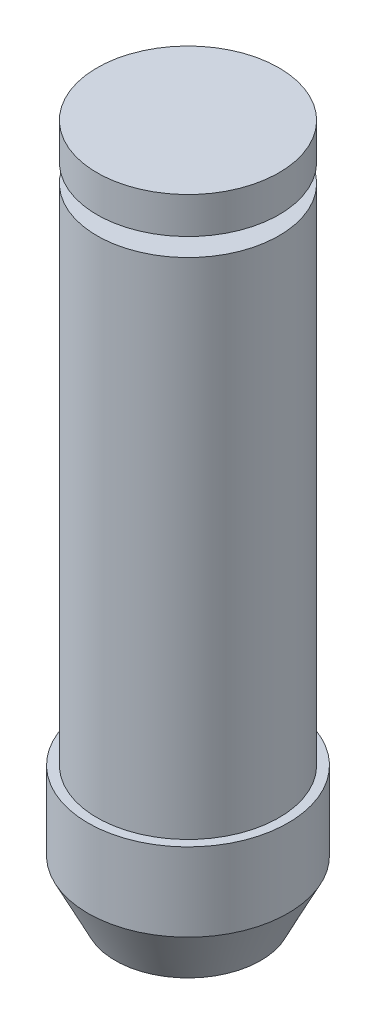
ISO-10303-21;
HEADER;
FILE_DESCRIPTION(('STEP AP214'),'2;1');
FILE_NAME('part.step','',(''),(''),'','','');
FILE_SCHEMA(('AUTOMOTIVE_DESIGN { 1 0 10303 214 1 1 1 1 }'));
ENDSEC;
DATA;
#1=APPLICATION_CONTEXT('core data for automotive mechanical design processes');
#2=APPLICATION_PROTOCOL_DEFINITION('international standard','automotive_design',2000,#1);
#3=PRODUCT_CONTEXT('',#1,'mechanical');
#4=PRODUCT('Part','Part','',(#3));
#5=PRODUCT_RELATED_PRODUCT_CATEGORY('part','',(#4));
#6=PRODUCT_DEFINITION_FORMATION('','',#4);
#7=PRODUCT_DEFINITION_CONTEXT('part definition',#1,'design');
#8=PRODUCT_DEFINITION('design','',#6,#7);
#9=PRODUCT_DEFINITION_SHAPE('','',#8);
#10=(LENGTH_UNIT() NAMED_UNIT(*) SI_UNIT(.MILLI.,.METRE.));
#11=(NAMED_UNIT(*) PLANE_ANGLE_UNIT() SI_UNIT($,.RADIAN.));
#12=(NAMED_UNIT(*) SI_UNIT($,.STERADIAN.) SOLID_ANGLE_UNIT());
#13=UNCERTAINTY_MEASURE_WITH_UNIT(LENGTH_MEASURE(1.E-05),#10,'distance_accuracy_value','');
#14=(GEOMETRIC_REPRESENTATION_CONTEXT(3) GLOBAL_UNCERTAINTY_ASSIGNED_CONTEXT((#13)) GLOBAL_UNIT_ASSIGNED_CONTEXT((#10,
#11,#12)) REPRESENTATION_CONTEXT('',''));
#15=CARTESIAN_POINT('',(0.,0.,0.));
#16=DIRECTION('',(0.,0.,1.));
#17=DIRECTION('',(1.,0.,0.));
#18=AXIS2_PLACEMENT_3D('',#15,#16,#17);
#19=CARTESIAN_POINT('',(0.,0.,0.));
#20=DIRECTION('',(0.,1.,0.));
#21=DIRECTION('',(0.,0.,1.));
#22=AXIS2_PLACEMENT_3D('',#19,#20,#21);
#23=PLANE('',#22);
#24=CARTESIAN_POINT('',(0.,0.,0.));
#25=DIRECTION('',(0.,-1.,0.));
#26=DIRECTION('',(0.,0.,-1.));
#27=AXIS2_PLACEMENT_3D('',#24,#25,#26);
#28=CIRCLE('',#27,40.);
#29=CARTESIAN_POINT('',(0.,0.,-40.));
#30=VERTEX_POINT('',#29);
#31=EDGE_CURVE('E10',#30,#30,#28,.T.);
#32=ORIENTED_EDGE('',*,*,#31,.T.);
#33=EDGE_LOOP('',(#32));
#34=FACE_BOUND('',#33,.T.);
#35=ADVANCED_FACE('F30',(#34),#23,.F.);
#36=CARTESIAN_POINT('',(0.,30.,0.));
#37=DIRECTION('',(0.,1.,0.));
#38=DIRECTION('',(0.,0.,1.));
#39=AXIS2_PLACEMENT_3D('',#36,#37,#38);
#40=CONICAL_SURFACE('',#39,55.,0.463647609000806);
#41=ORIENTED_EDGE('',*,*,#31,.F.);
#42=EDGE_LOOP('',(#41));
#43=FACE_BOUND('',#42,.T.);
#44=CARTESIAN_POINT('',(0.,30.,0.));
#45=DIRECTION('',(0.,-1.,0.));
#46=DIRECTION('',(0.,0.,-1.));
#47=AXIS2_PLACEMENT_3D('',#44,#45,#46);
#48=CIRCLE('',#47,55.);
#49=CARTESIAN_POINT('',(0.,30.,-55.));
#50=VERTEX_POINT('',#49);
#51=EDGE_CURVE('E36',#50,#50,#48,.T.);
#52=ORIENTED_EDGE('',*,*,#51,.T.);
#53=EDGE_LOOP('',(#52));
#54=FACE_BOUND('',#53,.T.);
#55=ADVANCED_FACE('F77',(#43,#54),#40,.T.);
#56=CARTESIAN_POINT('',(0.,-1000.,0.));
#57=DIRECTION('',(0.,-1.,0.));
#58=DIRECTION('',(0.,0.,-1.));
#59=AXIS2_PLACEMENT_3D('',#56,#57,#58);
#60=CYLINDRICAL_SURFACE('',#59,55.);
#61=ORIENTED_EDGE('',*,*,#51,.F.);
#62=EDGE_LOOP('',(#61));
#63=FACE_BOUND('',#62,.T.);
#64=CARTESIAN_POINT('',(0.,73.,0.));
#65=DIRECTION('',(0.,-1.,0.));
#66=DIRECTION('',(0.,0.,-1.));
#67=AXIS2_PLACEMENT_3D('',#64,#65,#66);
#68=CIRCLE('',#67,55.);
#69=CARTESIAN_POINT('',(0.,73.,-55.));
#70=VERTEX_POINT('',#69);
#71=EDGE_CURVE('E40',#70,#70,#68,.T.);
#72=ORIENTED_EDGE('',*,*,#71,.T.);
#73=EDGE_LOOP('',(#72));
#74=FACE_BOUND('',#73,.T.);
#75=ADVANCED_FACE('F81',(#63,#74),#60,.T.);
#76=CARTESIAN_POINT('',(-55.,73.,0.));
#77=DIRECTION('',(0.,-1.,0.));
#78=DIRECTION('',(0.,0.,-1.));
#79=AXIS2_PLACEMENT_3D('',#76,#77,#78);
#80=PLANE('',#79);
#81=ORIENTED_EDGE('',*,*,#71,.F.);
#82=EDGE_LOOP('',(#81));
#83=FACE_BOUND('',#82,.T.);
#84=CARTESIAN_POINT('',(0.,73.,0.));
#85=DIRECTION('',(0.,-1.,0.));
#86=DIRECTION('',(0.,0.,-1.));
#87=AXIS2_PLACEMENT_3D('',#84,#85,#86);
#88=CIRCLE('',#87,50.);
#89=CARTESIAN_POINT('',(0.,73.,-50.));
#90=VERTEX_POINT('',#89);
#91=EDGE_CURVE('E44',#90,#90,#88,.T.);
#92=ORIENTED_EDGE('',*,*,#91,.T.);
#93=EDGE_LOOP('',(#92));
#94=FACE_BOUND('',#93,.T.);
#95=ADVANCED_FACE('F86',(#83,#94),#80,.F.);
#96=CARTESIAN_POINT('',(0.,-1000.,0.));
#97=DIRECTION('',(0.,-1.,0.));
#98=DIRECTION('',(0.,0.,-1.));
#99=AXIS2_PLACEMENT_3D('',#96,#97,#98);
#100=CYLINDRICAL_SURFACE('',#99,50.);
#101=ORIENTED_EDGE('',*,*,#91,.F.);
#102=EDGE_LOOP('',(#101));
#103=FACE_BOUND('',#102,.T.);
#104=CARTESIAN_POINT('',(0.,350.,0.));
#105=DIRECTION('',(0.,-1.,0.));
#106=DIRECTION('',(0.,0.,-1.));
#107=AXIS2_PLACEMENT_3D('',#104,#105,#106);
#108=CIRCLE('',#107,50.);
#109=CARTESIAN_POINT('',(0.,350.,-50.));
#110=VERTEX_POINT('',#109);
#111=EDGE_CURVE('E49',#110,#110,#108,.T.);
#112=ORIENTED_EDGE('',*,*,#111,.T.);
#113=EDGE_LOOP('',(#112));
#114=FACE_BOUND('',#113,.T.);
#115=ADVANCED_FACE('F92',(#103,#114),#100,.T.);
#116=CARTESIAN_POINT('',(-50.,350.,0.));
#117=DIRECTION('',(0.,-1.,0.));
#118=DIRECTION('',(0.,0.,-1.));
#119=AXIS2_PLACEMENT_3D('',#116,#117,#118);
#120=PLANE('',#119);
#121=ORIENTED_EDGE('',*,*,#111,.F.);
#122=EDGE_LOOP('',(#121));
#123=FACE_BOUND('',#122,.T.);
#124=CARTESIAN_POINT('',(0.,350.,0.));
#125=DIRECTION('',(0.,-1.,0.));
#126=DIRECTION('',(0.,0.,-1.));
#127=AXIS2_PLACEMENT_3D('',#124,#125,#126);
#128=CIRCLE('',#127,35.);
#129=CARTESIAN_POINT('',(0.,350.,-35.));
#130=VERTEX_POINT('',#129);
#131=EDGE_CURVE('E52',#130,#130,#128,.T.);
#132=ORIENTED_EDGE('',*,*,#131,.T.);
#133=EDGE_LOOP('',(#132));
#134=FACE_BOUND('',#133,.T.);
#135=ADVANCED_FACE('F96',(#123,#134),#120,.F.);
#136=CARTESIAN_POINT('',(0.,-1000.,0.));
#137=DIRECTION('',(0.,-1.,0.));
#138=DIRECTION('',(0.,0.,-1.));
#139=AXIS2_PLACEMENT_3D('',#136,#137,#138);
#140=CYLINDRICAL_SURFACE('',#139,35.);
#141=ORIENTED_EDGE('',*,*,#131,.F.);
#142=EDGE_LOOP('',(#141));
#143=FACE_BOUND('',#142,.T.);
#144=CARTESIAN_POINT('',(0.,360.,0.));
#145=DIRECTION('',(0.,-1.,0.));
#146=DIRECTION('',(0.,0.,-1.));
#147=AXIS2_PLACEMENT_3D('',#144,#145,#146);
#148=CIRCLE('',#147,35.);
#149=CARTESIAN_POINT('',(0.,360.,-35.));
#150=VERTEX_POINT('',#149);
#151=EDGE_CURVE('E55',#150,#150,#148,.T.);
#152=ORIENTED_EDGE('',*,*,#151,.T.);
#153=EDGE_LOOP('',(#152));
#154=FACE_BOUND('',#153,.T.);
#155=ADVANCED_FACE('F100',(#143,#154),#140,.T.);
#156=CARTESIAN_POINT('',(-35.,360.,0.));
#157=DIRECTION('',(0.,1.,0.));
#158=DIRECTION('',(0.,0.,1.));
#159=AXIS2_PLACEMENT_3D('',#156,#157,#158);
#160=PLANE('',#159);
#161=ORIENTED_EDGE('',*,*,#151,.F.);
#162=EDGE_LOOP('',(#161));
#163=FACE_BOUND('',#162,.T.);
#164=CARTESIAN_POINT('',(0.,360.,0.));
#165=DIRECTION('',(0.,-1.,0.));
#166=DIRECTION('',(0.,0.,-1.));
#167=AXIS2_PLACEMENT_3D('',#164,#165,#166);
#168=CIRCLE('',#167,50.);
#169=CARTESIAN_POINT('',(0.,360.,-50.));
#170=VERTEX_POINT('',#169);
#171=EDGE_CURVE('E58',#170,#170,#168,.T.);
#172=ORIENTED_EDGE('',*,*,#171,.T.);
#173=EDGE_LOOP('',(#172));
#174=FACE_BOUND('',#173,.T.);
#175=ADVANCED_FACE('F73',(#163,#174),#160,.F.);
#176=CARTESIAN_POINT('',(0.,-1000.,0.));
#177=DIRECTION('',(0.,-1.,0.));
#178=DIRECTION('',(0.,0.,-1.));
#179=AXIS2_PLACEMENT_3D('',#176,#177,#178);
#180=CYLINDRICAL_SURFACE('',#179,50.);
#181=ORIENTED_EDGE('',*,*,#171,.F.);
#182=EDGE_LOOP('',(#181));
#183=FACE_BOUND('',#182,.T.);
#184=CARTESIAN_POINT('',(0.,380.,0.));
#185=DIRECTION('',(0.,-1.,0.));
#186=DIRECTION('',(0.,0.,-1.));
#187=AXIS2_PLACEMENT_3D('',#184,#185,#186);
#188=CIRCLE('',#187,50.);
#189=CARTESIAN_POINT('',(0.,380.,-50.));
#190=VERTEX_POINT('',#189);
#191=EDGE_CURVE('E61',#190,#190,#188,.T.);
#192=ORIENTED_EDGE('',*,*,#191,.T.);
#193=EDGE_LOOP('',(#192));
#194=FACE_BOUND('',#193,.T.);
#195=ADVANCED_FACE('F65',(#183,#194),#180,.T.);
#196=CARTESIAN_POINT('',(-50.,380.,0.));
#197=DIRECTION('',(0.,-1.,0.));
#198=DIRECTION('',(0.,0.,-1.));
#199=AXIS2_PLACEMENT_3D('',#196,#197,#198);
#200=PLANE('',#199);
#201=ORIENTED_EDGE('',*,*,#191,.F.);
#202=EDGE_LOOP('',(#201));
#203=FACE_BOUND('',#202,.T.);
#204=ADVANCED_FACE('F67',(#203),#200,.F.);
#205=CLOSED_SHELL('',(#35,#55,#75,#95,#115,#135,#155,#175,#195,#204));
#206=MANIFOLD_SOLID_BREP('B2',#205);
#207=ADVANCED_BREP_SHAPE_REPRESENTATION('',(#18,#206),#14);
#208=SHAPE_DEFINITION_REPRESENTATION(#9,#207);
ENDSEC;
END-ISO-10303-21;
